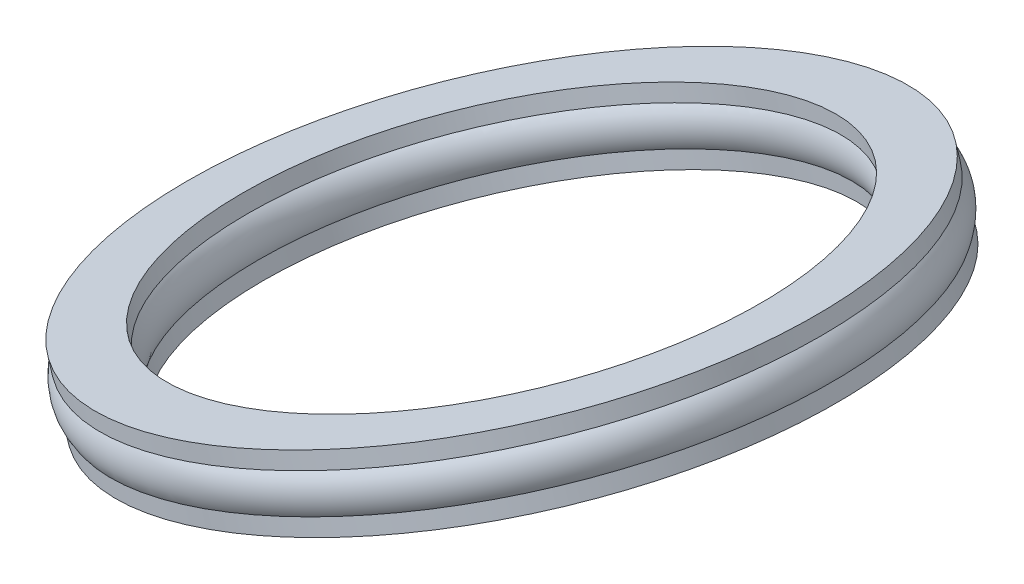
ISO-10303-21;
HEADER;
FILE_DESCRIPTION(('STEP AP214'),'2;1');
FILE_NAME('part.step','',(''),(''),'','','');
FILE_SCHEMA(('AUTOMOTIVE_DESIGN { 1 0 10303 214 1 1 1 1 }'));
ENDSEC;
DATA;
#1=APPLICATION_CONTEXT('core data for automotive mechanical design processes');
#2=APPLICATION_PROTOCOL_DEFINITION('international standard','automotive_design',2000,#1);
#3=PRODUCT_CONTEXT('',#1,'mechanical');
#4=PRODUCT('Part','Part','',(#3));
#5=PRODUCT_RELATED_PRODUCT_CATEGORY('part','',(#4));
#6=PRODUCT_DEFINITION_FORMATION('','',#4);
#7=PRODUCT_DEFINITION_CONTEXT('part definition',#1,'design');
#8=PRODUCT_DEFINITION('design','',#6,#7);
#9=PRODUCT_DEFINITION_SHAPE('','',#8);
#10=(LENGTH_UNIT() NAMED_UNIT(*) SI_UNIT(.MILLI.,.METRE.));
#11=(NAMED_UNIT(*) PLANE_ANGLE_UNIT() SI_UNIT($,.RADIAN.));
#12=(NAMED_UNIT(*) SI_UNIT($,.STERADIAN.) SOLID_ANGLE_UNIT());
#13=UNCERTAINTY_MEASURE_WITH_UNIT(LENGTH_MEASURE(1.E-05),#10,'distance_accuracy_value','');
#14=(GEOMETRIC_REPRESENTATION_CONTEXT(3) GLOBAL_UNCERTAINTY_ASSIGNED_CONTEXT((#13)) GLOBAL_UNIT_ASSIGNED_CONTEXT((#10,
#11,#12)) REPRESENTATION_CONTEXT('',''));
#15=CARTESIAN_POINT('',(0.,0.,0.));
#16=DIRECTION('',(0.,0.,1.));
#17=DIRECTION('',(1.,0.,0.));
#18=AXIS2_PLACEMENT_3D('',#15,#16,#17);
#19=CARTESIAN_POINT('',(363.691428608251,538.34457131179,0.));
#20=DIRECTION('',(-0.300714282645771,0.953714275982508,0.));
#21=DIRECTION('',(-0.953714275982508,-0.300714282645771,0.));
#22=AXIS2_PLACEMENT_3D('',#19,#20,#21);
#23=CYLINDRICAL_SURFACE('',#22,15.7999999999999);
#24=CARTESIAN_POINT('',(365.19500002148,533.575999931877,0.));
#25=DIRECTION('',(-0.300714282645771,0.953714275982508,0.));
#26=DIRECTION('',(-0.953714275982508,-0.300714282645771,0.));
#27=AXIS2_PLACEMENT_3D('',#24,#25,#26);
#28=CIRCLE('',#27,15.7999999999999);
#29=CARTESIAN_POINT('',(350.126314460956,528.824714266074,0.));
#30=VERTEX_POINT('',#29);
#31=EDGE_CURVE('E36',#30,#30,#28,.T.);
#32=ORIENTED_EDGE('',*,*,#31,.T.);
#33=EDGE_LOOP('',(#32));
#34=FACE_BOUND('',#33,.T.);
#35=CARTESIAN_POINT('',(365.479606430722,532.673371719003,0.));
#36=DIRECTION('',(0.300714282645775,-0.953714275982507,0.));
#37=DIRECTION('',(0.953714275982507,0.300714282645775,0.));
#38=AXIS2_PLACEMENT_3D('',#35,#36,#37);
#39=CIRCLE('',#38,15.7999999999999);
#40=CARTESIAN_POINT('',(380.548291991245,537.424657384806,0.));
#41=VERTEX_POINT('',#40);
#42=EDGE_CURVE('E10',#41,#41,#39,.F.);
#43=ORIENTED_EDGE('',*,*,#42,.F.);
#44=EDGE_LOOP('',(#43));
#45=FACE_BOUND('',#44,.T.);
#46=ADVANCED_FACE('F33',(#34,#45),#23,.F.);
#47=CARTESIAN_POINT('',(363.691428608251,538.34457131179,0.));
#48=DIRECTION('',(-0.300714282645771,0.953714275982508,0.));
#49=DIRECTION('',(-0.953714275982508,-0.300714282645771,0.));
#50=AXIS2_PLACEMENT_3D('',#47,#48,#49);
#51=CYLINDRICAL_SURFACE('',#50,19.2);
#52=CARTESIAN_POINT('',(365.19500002148,533.575999931877,0.));
#53=DIRECTION('',(-0.300714282645771,0.953714275982508,0.));
#54=DIRECTION('',(-0.953714275982508,-0.300714282645771,0.));
#55=AXIS2_PLACEMENT_3D('',#52,#53,#54);
#56=CIRCLE('',#55,19.1999999999999);
#57=CARTESIAN_POINT('',(346.883685922616,527.802285705079,0.));
#58=VERTEX_POINT('',#57);
#59=EDGE_CURVE('E54',#58,#58,#56,.T.);
#60=ORIENTED_EDGE('',*,*,#59,.F.);
#61=EDGE_LOOP('',(#60));
#62=FACE_BOUND('',#61,.T.);
#63=CARTESIAN_POINT('',(365.479606430722,532.673371719003,0.));
#64=DIRECTION('',(0.300714282645775,-0.953714275982507,0.));
#65=DIRECTION('',(0.953714275982507,0.300714282645775,0.));
#66=AXIS2_PLACEMENT_3D('',#63,#64,#65);
#67=CIRCLE('',#66,19.2);
#68=CARTESIAN_POINT('',(383.790920529586,538.447085945802,0.));
#69=VERTEX_POINT('',#68);
#70=EDGE_CURVE('E45',#69,#69,#67,.T.);
#71=ORIENTED_EDGE('',*,*,#70,.F.);
#72=EDGE_LOOP('',(#71));
#73=FACE_BOUND('',#72,.T.);
#74=ADVANCED_FACE('F71',(#62,#73),#51,.T.);
#75=CARTESIAN_POINT('',(380.263685582003,538.327285597681,0.));
#76=DIRECTION('',(0.300714282645771,-0.953714275982508,0.));
#77=DIRECTION('',(0.953714275982508,0.300714282645771,0.));
#78=AXIS2_PLACEMENT_3D('',#75,#76,#77);
#79=PLANE('',#78);
#80=ORIENTED_EDGE('',*,*,#59,.T.);
#81=EDGE_LOOP('',(#80));
#82=FACE_BOUND('',#81,.T.);
#83=ORIENTED_EDGE('',*,*,#31,.F.);
#84=EDGE_LOOP('',(#83));
#85=FACE_BOUND('',#84,.T.);
#86=ADVANCED_FACE('F73',(#82,#85),#79,.F.);
#87=CARTESIAN_POINT('',(365.796428586771,531.668571379912,0.));
#88=DIRECTION('',(-0.300714282645775,0.953714275982507,0.));
#89=DIRECTION('',(-0.953714275982507,-0.300714282645775,0.));
#90=AXIS2_PLACEMENT_3D('',#87,#88,#89);
#91=TOROIDAL_SURFACE('',#90,17.4999999999999,2.);
#92=CARTESIAN_POINT('',(366.113250742821,530.663771040822,0.));
#93=DIRECTION('',(-0.300714282645775,0.953714275982507,0.));
#94=DIRECTION('',(-0.953714275982507,-0.300714282645775,0.));
#95=AXIS2_PLACEMENT_3D('',#92,#93,#94);
#96=CIRCLE('',#95,19.2);
#97=CARTESIAN_POINT('',(347.801936643956,524.890056814023,0.));
#98=VERTEX_POINT('',#97);
#99=EDGE_CURVE('E59',#98,#98,#96,.T.);
#100=ORIENTED_EDGE('',*,*,#99,.T.);
#101=EDGE_LOOP('',(#100));
#102=FACE_BOUND('',#101,.T.);
#103=ORIENTED_EDGE('',*,*,#70,.T.);
#104=EDGE_LOOP('',(#103));
#105=FACE_BOUND('',#104,.T.);
#106=ADVANCED_FACE('F69',(#102,#105),#91,.T.);
#107=CARTESIAN_POINT('',(384.709171250927,535.534857054746,0.));
#108=DIRECTION('',(-0.300714282645771,0.953714275982508,0.));
#109=DIRECTION('',(-0.953714275982508,-0.300714282645771,0.));
#110=AXIS2_PLACEMENT_3D('',#107,#108,#109);
#111=PLANE('',#110);
#112=CARTESIAN_POINT('',(366.397857152063,529.761142827948,0.));
#113=DIRECTION('',(-0.300714282645771,0.953714275982508,0.));
#114=DIRECTION('',(-0.953714275982508,-0.300714282645771,0.));
#115=AXIS2_PLACEMENT_3D('',#112,#113,#114);
#116=CIRCLE('',#115,19.2);
#117=CARTESIAN_POINT('',(348.086543053199,523.987428601149,0.));
#118=VERTEX_POINT('',#117);
#119=EDGE_CURVE('E52',#118,#118,#116,.T.);
#120=ORIENTED_EDGE('',*,*,#119,.F.);
#121=EDGE_LOOP('',(#120));
#122=FACE_BOUND('',#121,.T.);
#123=CARTESIAN_POINT('',(366.397857152063,529.761142827948,0.));
#124=DIRECTION('',(-0.300714282645771,0.953714275982508,0.));
#125=DIRECTION('',(-0.953714275982508,-0.300714282645771,0.));
#126=AXIS2_PLACEMENT_3D('',#123,#124,#125);
#127=CIRCLE('',#126,15.8);
#128=CARTESIAN_POINT('',(351.329171591539,525.009857162144,0.));
#129=VERTEX_POINT('',#128);
#130=EDGE_CURVE('E49',#129,#129,#127,.T.);
#131=ORIENTED_EDGE('',*,*,#130,.T.);
#132=EDGE_LOOP('',(#131));
#133=FACE_BOUND('',#132,.T.);
#134=ADVANCED_FACE('F84',(#122,#133),#111,.F.);
#135=ORIENTED_EDGE('',*,*,#119,.T.);
#136=EDGE_LOOP('',(#135));
#137=FACE_BOUND('',#136,.T.);
#138=ORIENTED_EDGE('',*,*,#99,.F.);
#139=EDGE_LOOP('',(#138));
#140=FACE_BOUND('',#139,.T.);
#141=ADVANCED_FACE('F76',(#137,#140),#51,.T.);
#142=ORIENTED_EDGE('',*,*,#130,.F.);
#143=EDGE_LOOP('',(#142));
#144=FACE_BOUND('',#143,.T.);
#145=CARTESIAN_POINT('',(366.113250742821,530.663771040822,0.));
#146=DIRECTION('',(-0.300714282645775,0.953714275982507,0.));
#147=DIRECTION('',(-0.953714275982507,-0.300714282645775,0.));
#148=AXIS2_PLACEMENT_3D('',#145,#146,#147);
#149=CIRCLE('',#148,15.7999999999999);
#150=CARTESIAN_POINT('',(351.044565182297,525.912485375019,0.));
#151=VERTEX_POINT('',#150);
#152=EDGE_CURVE('E40',#151,#151,#149,.F.);
#153=ORIENTED_EDGE('',*,*,#152,.F.);
#154=EDGE_LOOP('',(#153));
#155=FACE_BOUND('',#154,.T.);
#156=ADVANCED_FACE('F81',(#144,#155),#23,.F.);
#157=ORIENTED_EDGE('',*,*,#152,.T.);
#158=EDGE_LOOP('',(#157));
#159=FACE_BOUND('',#158,.T.);
#160=ORIENTED_EDGE('',*,*,#42,.T.);
#161=EDGE_LOOP('',(#160));
#162=FACE_BOUND('',#161,.T.);
#163=ADVANCED_FACE('F90',(#159,#162),#91,.T.);
#164=CLOSED_SHELL('',(#46,#74,#86,#106,#134,#141,#156,#163));
#165=MANIFOLD_SOLID_BREP('B2',#164);
#166=ADVANCED_BREP_SHAPE_REPRESENTATION('',(#18,#165),#14);
#167=SHAPE_DEFINITION_REPRESENTATION(#9,#166);
ENDSEC;
END-ISO-10303-21;
